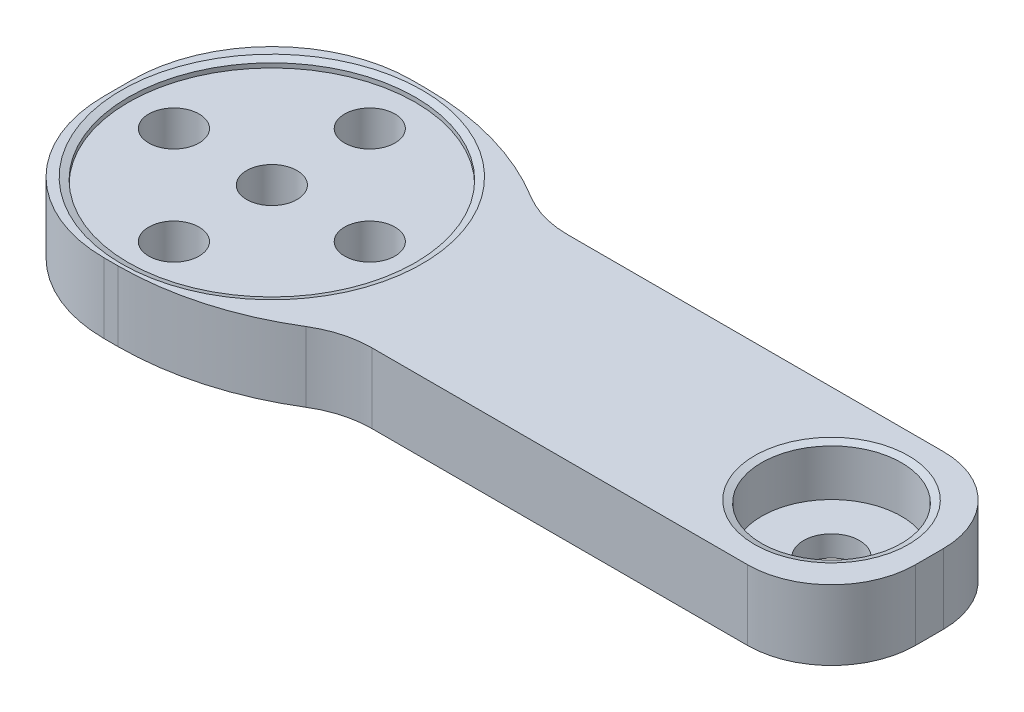
ISO-10303-21;
HEADER;
FILE_DESCRIPTION(('STEP AP214'),'2;1');
FILE_NAME('part.step','',(''),(''),'','','');
FILE_SCHEMA(('AUTOMOTIVE_DESIGN { 1 0 10303 214 1 1 1 1 }'));
ENDSEC;
DATA;
#1=APPLICATION_CONTEXT('core data for automotive mechanical design processes');
#2=APPLICATION_PROTOCOL_DEFINITION('international standard','automotive_design',2000,#1);
#3=PRODUCT_CONTEXT('',#1,'mechanical');
#4=PRODUCT('Part','Part','',(#3));
#5=PRODUCT_RELATED_PRODUCT_CATEGORY('part','',(#4));
#6=PRODUCT_DEFINITION_FORMATION('','',#4);
#7=PRODUCT_DEFINITION_CONTEXT('part definition',#1,'design');
#8=PRODUCT_DEFINITION('design','',#6,#7);
#9=PRODUCT_DEFINITION_SHAPE('','',#8);
#10=(LENGTH_UNIT() NAMED_UNIT(*) SI_UNIT(.MILLI.,.METRE.));
#11=(NAMED_UNIT(*) PLANE_ANGLE_UNIT() SI_UNIT($,.RADIAN.));
#12=(NAMED_UNIT(*) SI_UNIT($,.STERADIAN.) SOLID_ANGLE_UNIT());
#13=UNCERTAINTY_MEASURE_WITH_UNIT(LENGTH_MEASURE(1.E-05),#10,'distance_accuracy_value','');
#14=(GEOMETRIC_REPRESENTATION_CONTEXT(3) GLOBAL_UNCERTAINTY_ASSIGNED_CONTEXT((#13)) GLOBAL_UNIT_ASSIGNED_CONTEXT((#10,
#11,#12)) REPRESENTATION_CONTEXT('',''));
#15=CARTESIAN_POINT('',(0.,0.,0.));
#16=DIRECTION('',(0.,0.,1.));
#17=DIRECTION('',(1.,0.,0.));
#18=AXIS2_PLACEMENT_3D('',#15,#16,#17);
#19=CARTESIAN_POINT('',(29.,5.,11.));
#20=DIRECTION('',(-1.,0.,0.));
#21=DIRECTION('',(0.,0.,1.));
#22=AXIS2_PLACEMENT_3D('',#19,#20,#21);
#23=PLANE('',#22);
#24=DIRECTION('',(0.,0.,-1.));
#25=VECTOR('',#24,1.);
#26=CARTESIAN_POINT('',(29.,0.,11.));
#27=LINE('',#26,#25);
#28=CARTESIAN_POINT('',(29.,0.,1.));
#29=VERTEX_POINT('',#28);
#30=CARTESIAN_POINT('',(29.,0.,-0.999999999999999));
#31=VERTEX_POINT('',#30);
#32=EDGE_CURVE('E179',#29,#31,#27,.T.);
#33=ORIENTED_EDGE('',*,*,#32,.T.);
#34=DIRECTION('',(0.,1.,0.));
#35=VECTOR('',#34,1.);
#36=CARTESIAN_POINT('',(29.,5.,-0.999999999999999));
#37=LINE('',#36,#35);
#38=CARTESIAN_POINT('',(29.,5.,-0.999999999999999));
#39=VERTEX_POINT('',#38);
#40=EDGE_CURVE('E232',#31,#39,#37,.T.);
#41=ORIENTED_EDGE('',*,*,#40,.T.);
#42=DIRECTION('',(0.,0.,-1.));
#43=VECTOR('',#42,1.);
#44=CARTESIAN_POINT('',(29.,5.,11.));
#45=LINE('',#44,#43);
#46=CARTESIAN_POINT('',(29.,5.,1.));
#47=VERTEX_POINT('',#46);
#48=EDGE_CURVE('E177',#47,#39,#45,.T.);
#49=ORIENTED_EDGE('',*,*,#48,.F.);
#50=DIRECTION('',(0.,1.,0.));
#51=VECTOR('',#50,1.);
#52=CARTESIAN_POINT('',(29.,5.,1.));
#53=LINE('',#52,#51);
#54=EDGE_CURVE('E229',#47,#29,#53,.F.);
#55=ORIENTED_EDGE('',*,*,#54,.T.);
#56=EDGE_LOOP('',(#33,#41,#49,#55));
#57=FACE_BOUND('',#56,.T.);
#58=ADVANCED_FACE('F41',(#57),#23,.F.);
#59=CARTESIAN_POINT('',(-29.,5.,-11.));
#60=DIRECTION('',(0.,0.,1.));
#61=DIRECTION('',(1.,0.,0.));
#62=AXIS2_PLACEMENT_3D('',#59,#60,#61);
#63=PLANE('',#62);
#64=DIRECTION('',(-1.,0.,0.));
#65=VECTOR('',#64,1.);
#66=CARTESIAN_POINT('',(-29.,5.,-11.));
#67=LINE('',#66,#65);
#68=CARTESIAN_POINT('',(-18.,5.,-11.));
#69=VERTEX_POINT('',#68);
#70=CARTESIAN_POINT('',(-19.,5.,-11.));
#71=VERTEX_POINT('',#70);
#72=EDGE_CURVE('E301',#69,#71,#67,.T.);
#73=ORIENTED_EDGE('',*,*,#72,.F.);
#74=DIRECTION('',(0.,1.,0.));
#75=VECTOR('',#74,1.);
#76=CARTESIAN_POINT('',(-18.,5.,-11.));
#77=LINE('',#76,#75);
#78=CARTESIAN_POINT('',(-18.,0.,-11.));
#79=VERTEX_POINT('',#78);
#80=EDGE_CURVE('E264',#69,#79,#77,.F.);
#81=ORIENTED_EDGE('',*,*,#80,.T.);
#82=DIRECTION('',(-1.,0.,0.));
#83=VECTOR('',#82,1.);
#84=CARTESIAN_POINT('',(-29.,0.,-11.));
#85=LINE('',#84,#83);
#86=CARTESIAN_POINT('',(-19.,0.,-11.));
#87=VERTEX_POINT('',#86);
#88=EDGE_CURVE('E172',#79,#87,#85,.T.);
#89=ORIENTED_EDGE('',*,*,#88,.T.);
#90=DIRECTION('',(0.,-1.,0.));
#91=VECTOR('',#90,1.);
#92=CARTESIAN_POINT('',(-19.,5.,-11.));
#93=LINE('',#92,#91);
#94=EDGE_CURVE('E149',#87,#71,#93,.F.);
#95=ORIENTED_EDGE('',*,*,#94,.T.);
#96=EDGE_LOOP('',(#73,#81,#89,#95));
#97=FACE_BOUND('',#96,.T.);
#98=ADVANCED_FACE('F397',(#97),#63,.F.);
#99=CARTESIAN_POINT('',(-29.,5.,11.));
#100=DIRECTION('',(1.,0.,0.));
#101=DIRECTION('',(0.,0.,-1.));
#102=AXIS2_PLACEMENT_3D('',#99,#100,#101);
#103=PLANE('',#102);
#104=DIRECTION('',(0.,0.,1.));
#105=VECTOR('',#104,1.);
#106=CARTESIAN_POINT('',(-29.,5.,11.));
#107=LINE('',#106,#105);
#108=CARTESIAN_POINT('',(-29.,5.,-0.999999999999999));
#109=VERTEX_POINT('',#108);
#110=CARTESIAN_POINT('',(-29.,5.,0.999999999999999));
#111=VERTEX_POINT('',#110);
#112=EDGE_CURVE('E163',#109,#111,#107,.T.);
#113=ORIENTED_EDGE('',*,*,#112,.F.);
#114=DIRECTION('',(0.,-1.,0.));
#115=VECTOR('',#114,1.);
#116=CARTESIAN_POINT('',(-29.,5.,-0.999999999999999));
#117=LINE('',#116,#115);
#118=CARTESIAN_POINT('',(-29.,0.,-0.999999999999999));
#119=VERTEX_POINT('',#118);
#120=EDGE_CURVE('E147',#109,#119,#117,.T.);
#121=ORIENTED_EDGE('',*,*,#120,.T.);
#122=DIRECTION('',(0.,0.,1.));
#123=VECTOR('',#122,1.);
#124=CARTESIAN_POINT('',(-29.,0.,11.));
#125=LINE('',#124,#123);
#126=CARTESIAN_POINT('',(-29.,0.,0.999999999999999));
#127=VERTEX_POINT('',#126);
#128=EDGE_CURVE('E160',#119,#127,#125,.T.);
#129=ORIENTED_EDGE('',*,*,#128,.T.);
#130=DIRECTION('',(0.,-1.,0.));
#131=VECTOR('',#130,1.);
#132=CARTESIAN_POINT('',(-29.,5.,0.999999999999999));
#133=LINE('',#132,#131);
#134=EDGE_CURVE('E165',#127,#111,#133,.F.);
#135=ORIENTED_EDGE('',*,*,#134,.T.);
#136=EDGE_LOOP('',(#113,#121,#129,#135));
#137=FACE_BOUND('',#136,.T.);
#138=ADVANCED_FACE('F159',(#137),#103,.F.);
#139=CARTESIAN_POINT('',(-29.,5.,11.));
#140=DIRECTION('',(0.,0.,-1.));
#141=DIRECTION('',(-1.,0.,0.));
#142=AXIS2_PLACEMENT_3D('',#139,#140,#141);
#143=PLANE('',#142);
#144=DIRECTION('',(1.,0.,0.));
#145=VECTOR('',#144,1.);
#146=CARTESIAN_POINT('',(-29.,0.,11.));
#147=LINE('',#146,#145);
#148=CARTESIAN_POINT('',(-19.,0.,11.));
#149=VERTEX_POINT('',#148);
#150=CARTESIAN_POINT('',(-18.,0.,11.));
#151=VERTEX_POINT('',#150);
#152=EDGE_CURVE('E171',#149,#151,#147,.T.);
#153=ORIENTED_EDGE('',*,*,#152,.T.);
#154=DIRECTION('',(0.,-1.,0.));
#155=VECTOR('',#154,1.);
#156=CARTESIAN_POINT('',(-18.,5.,11.));
#157=LINE('',#156,#155);
#158=CARTESIAN_POINT('',(-18.,5.,11.));
#159=VERTEX_POINT('',#158);
#160=EDGE_CURVE('E273',#151,#159,#157,.F.);
#161=ORIENTED_EDGE('',*,*,#160,.T.);
#162=DIRECTION('',(1.,0.,0.));
#163=VECTOR('',#162,1.);
#164=CARTESIAN_POINT('',(-29.,5.,11.));
#165=LINE('',#164,#163);
#166=CARTESIAN_POINT('',(-19.,5.,11.));
#167=VERTEX_POINT('',#166);
#168=EDGE_CURVE('E187',#167,#159,#165,.T.);
#169=ORIENTED_EDGE('',*,*,#168,.F.);
#170=DIRECTION('',(0.,-1.,0.));
#171=VECTOR('',#170,1.);
#172=CARTESIAN_POINT('',(-19.,5.,11.));
#173=LINE('',#172,#171);
#174=EDGE_CURVE('E225',#167,#149,#173,.T.);
#175=ORIENTED_EDGE('',*,*,#174,.T.);
#176=EDGE_LOOP('',(#153,#161,#169,#175));
#177=FACE_BOUND('',#176,.T.);
#178=ADVANCED_FACE('F454',(#177),#143,.F.);
#179=CARTESIAN_POINT('',(0.,5.,0.));
#180=DIRECTION('',(0.,-1.,0.));
#181=DIRECTION('',(0.,0.,-1.));
#182=AXIS2_PLACEMENT_3D('',#179,#180,#181);
#183=PLANE('',#182);
#184=CARTESIAN_POINT('',(-18.,5.,0.));
#185=DIRECTION('',(0.,-1.,0.));
#186=DIRECTION('',(0.,0.,-1.));
#187=AXIS2_PLACEMENT_3D('',#184,#185,#186);
#188=CIRCLE('',#187,10.75);
#189=CARTESIAN_POINT('',(-18.,5.,-10.75));
#190=VERTEX_POINT('',#189);
#191=EDGE_CURVE('E199',#190,#190,#188,.T.);
#192=ORIENTED_EDGE('',*,*,#191,.T.);
#193=EDGE_LOOP('',(#192));
#194=FACE_BOUND('',#193,.T.);
#195=CARTESIAN_POINT('',(22.,5.,0.));
#196=DIRECTION('',(0.,-1.,0.));
#197=DIRECTION('',(0.,0.,-1.));
#198=AXIS2_PLACEMENT_3D('',#195,#196,#197);
#199=CIRCLE('',#198,5.50000000000002);
#200=CARTESIAN_POINT('',(22.,5.,5.50000000000002));
#201=VERTEX_POINT('',#200);
#202=EDGE_CURVE('E195',#201,#201,#199,.T.);
#203=ORIENTED_EDGE('',*,*,#202,.T.);
#204=EDGE_LOOP('',(#203));
#205=FACE_BOUND('',#204,.T.);
#206=DIRECTION('',(1.,0.,0.));
#207=VECTOR('',#206,1.);
#208=CARTESIAN_POINT('',(29.,5.,-7.));
#209=LINE('',#208,#207);
#210=CARTESIAN_POINT('',(-3.85786437626905,5.,-6.99999999999999));
#211=VERTEX_POINT('',#210);
#212=CARTESIAN_POINT('',(23.,5.,-7.));
#213=VERTEX_POINT('',#212);
#214=EDGE_CURVE('E362',#211,#213,#209,.T.);
#215=ORIENTED_EDGE('',*,*,#214,.F.);
#216=CARTESIAN_POINT('',(-3.85786437626905,5.,-14.));
#217=DIRECTION('',(0.,-1.,0.));
#218=DIRECTION('',(0.,0.,-1.));
#219=AXIS2_PLACEMENT_3D('',#216,#217,#218);
#220=CIRCLE('',#219,7.);
#221=CARTESIAN_POINT('',(-7.52434398242152,5.,-8.03703703703703));
#222=VERTEX_POINT('',#221);
#223=EDGE_CURVE('E50',#211,#222,#220,.T.);
#224=ORIENTED_EDGE('',*,*,#223,.T.);
#225=CARTESIAN_POINT('',(-18.,5.,9.));
#226=DIRECTION('',(0.,-1.,0.));
#227=DIRECTION('',(0.,0.,-1.));
#228=AXIS2_PLACEMENT_3D('',#225,#226,#227);
#229=CIRCLE('',#228,20.);
#230=EDGE_CURVE('E261',#222,#69,#229,.F.);
#231=ORIENTED_EDGE('',*,*,#230,.T.);
#232=ORIENTED_EDGE('',*,*,#72,.T.);
#233=CARTESIAN_POINT('',(-19.,5.,-0.999999999999999));
#234=DIRECTION('',(0.,-1.,0.));
#235=DIRECTION('',(0.,0.,-1.));
#236=AXIS2_PLACEMENT_3D('',#233,#234,#235);
#237=CIRCLE('',#236,10.);
#238=EDGE_CURVE('E222',#71,#109,#237,.F.);
#239=ORIENTED_EDGE('',*,*,#238,.T.);
#240=ORIENTED_EDGE('',*,*,#112,.T.);
#241=CARTESIAN_POINT('',(-19.,5.,0.999999999999999));
#242=DIRECTION('',(0.,-1.,0.));
#243=DIRECTION('',(0.,0.,-1.));
#244=AXIS2_PLACEMENT_3D('',#241,#242,#243);
#245=CIRCLE('',#244,10.);
#246=EDGE_CURVE('E219',#111,#167,#245,.F.);
#247=ORIENTED_EDGE('',*,*,#246,.T.);
#248=ORIENTED_EDGE('',*,*,#168,.T.);
#249=CARTESIAN_POINT('',(-18.,5.,-9.));
#250=DIRECTION('',(0.,-1.,0.));
#251=DIRECTION('',(0.,0.,-1.));
#252=AXIS2_PLACEMENT_3D('',#249,#250,#251);
#253=CIRCLE('',#252,20.);
#254=CARTESIAN_POINT('',(-7.52434398242152,5.,8.03703703703704));
#255=VERTEX_POINT('',#254);
#256=EDGE_CURVE('E257',#159,#255,#253,.F.);
#257=ORIENTED_EDGE('',*,*,#256,.T.);
#258=CARTESIAN_POINT('',(-3.85786437626905,5.,14.));
#259=DIRECTION('',(0.,-1.,0.));
#260=DIRECTION('',(0.,0.,-1.));
#261=AXIS2_PLACEMENT_3D('',#258,#259,#260);
#262=CIRCLE('',#261,7.);
#263=CARTESIAN_POINT('',(-3.85786437626906,5.,7.00000000000001));
#264=VERTEX_POINT('',#263);
#265=EDGE_CURVE('E290',#255,#264,#262,.T.);
#266=ORIENTED_EDGE('',*,*,#265,.T.);
#267=DIRECTION('',(-1.,0.,0.));
#268=VECTOR('',#267,1.);
#269=CARTESIAN_POINT('',(29.,5.,7.));
#270=LINE('',#269,#268);
#271=CARTESIAN_POINT('',(23.,5.,7.));
#272=VERTEX_POINT('',#271);
#273=EDGE_CURVE('E363',#272,#264,#270,.T.);
#274=ORIENTED_EDGE('',*,*,#273,.F.);
#275=CARTESIAN_POINT('',(23.,5.,1.));
#276=DIRECTION('',(0.,-1.,0.));
#277=DIRECTION('',(0.,0.,-1.));
#278=AXIS2_PLACEMENT_3D('',#275,#276,#277);
#279=CIRCLE('',#278,6.);
#280=EDGE_CURVE('E236',#272,#47,#279,.F.);
#281=ORIENTED_EDGE('',*,*,#280,.T.);
#282=ORIENTED_EDGE('',*,*,#48,.T.);
#283=CARTESIAN_POINT('',(23.,5.,-0.999999999999999));
#284=DIRECTION('',(0.,-1.,0.));
#285=DIRECTION('',(0.,0.,-1.));
#286=AXIS2_PLACEMENT_3D('',#283,#284,#285);
#287=CIRCLE('',#286,6.);
#288=EDGE_CURVE('E239',#39,#213,#287,.F.);
#289=ORIENTED_EDGE('',*,*,#288,.T.);
#290=EDGE_LOOP('',(#215,#224,#231,#232,#239,#240,#247,#248,#257,#266,#274,#281,#282,#289));
#291=FACE_BOUND('',#290,.T.);
#292=ADVANCED_FACE('F456',(#194,#205,#291),#183,.F.);
#293=CARTESIAN_POINT('',(0.,0.,0.));
#294=DIRECTION('',(0.,-1.,0.));
#295=DIRECTION('',(0.,0.,-1.));
#296=AXIS2_PLACEMENT_3D('',#293,#294,#295);
#297=PLANE('',#296);
#298=CARTESIAN_POINT('',(22.,0.,0.));
#299=DIRECTION('',(0.,-1.,0.));
#300=DIRECTION('',(0.,0.,-1.));
#301=AXIS2_PLACEMENT_3D('',#298,#299,#300);
#302=CIRCLE('',#301,2.);
#303=CARTESIAN_POINT('',(22.,0.,-2.));
#304=VERTEX_POINT('',#303);
#305=EDGE_CURVE('E207',#304,#304,#302,.T.);
#306=ORIENTED_EDGE('',*,*,#305,.F.);
#307=EDGE_LOOP('',(#306));
#308=FACE_BOUND('',#307,.T.);
#309=ORIENTED_EDGE('',*,*,#88,.F.);
#310=CARTESIAN_POINT('',(-18.,0.,9.));
#311=DIRECTION('',(0.,-1.,0.));
#312=DIRECTION('',(0.,0.,-1.));
#313=AXIS2_PLACEMENT_3D('',#310,#311,#312);
#314=CIRCLE('',#313,20.);
#315=CARTESIAN_POINT('',(-7.52434398242152,0.,-8.03703703703703));
#316=VERTEX_POINT('',#315);
#317=EDGE_CURVE('E270',#79,#316,#314,.T.);
#318=ORIENTED_EDGE('',*,*,#317,.T.);
#319=CARTESIAN_POINT('',(-3.85786437626905,0.,-14.));
#320=DIRECTION('',(0.,-1.,0.));
#321=DIRECTION('',(0.,0.,-1.));
#322=AXIS2_PLACEMENT_3D('',#319,#320,#321);
#323=CIRCLE('',#322,7.);
#324=CARTESIAN_POINT('',(-3.85786437626905,0.,-6.99999999999999));
#325=VERTEX_POINT('',#324);
#326=EDGE_CURVE('E11',#316,#325,#323,.F.);
#327=ORIENTED_EDGE('',*,*,#326,.T.);
#328=DIRECTION('',(-1.,0.,0.));
#329=VECTOR('',#328,1.);
#330=CARTESIAN_POINT('',(0.,0.,-7.));
#331=LINE('',#330,#329);
#332=CARTESIAN_POINT('',(23.,0.,-7.));
#333=VERTEX_POINT('',#332);
#334=EDGE_CURVE('E186',#333,#325,#331,.T.);
#335=ORIENTED_EDGE('',*,*,#334,.F.);
#336=CARTESIAN_POINT('',(23.,0.,-0.999999999999999));
#337=DIRECTION('',(0.,-1.,0.));
#338=DIRECTION('',(0.,0.,-1.));
#339=AXIS2_PLACEMENT_3D('',#336,#337,#338);
#340=CIRCLE('',#339,6.);
#341=EDGE_CURVE('E250',#333,#31,#340,.T.);
#342=ORIENTED_EDGE('',*,*,#341,.T.);
#343=ORIENTED_EDGE('',*,*,#32,.F.);
#344=CARTESIAN_POINT('',(23.,0.,1.));
#345=DIRECTION('',(0.,-1.,0.));
#346=DIRECTION('',(0.,0.,-1.));
#347=AXIS2_PLACEMENT_3D('',#344,#345,#346);
#348=CIRCLE('',#347,6.);
#349=CARTESIAN_POINT('',(23.,0.,7.));
#350=VERTEX_POINT('',#349);
#351=EDGE_CURVE('E246',#29,#350,#348,.T.);
#352=ORIENTED_EDGE('',*,*,#351,.T.);
#353=DIRECTION('',(1.,0.,0.));
#354=VECTOR('',#353,1.);
#355=CARTESIAN_POINT('',(0.,0.,7.00000000000001));
#356=LINE('',#355,#354);
#357=CARTESIAN_POINT('',(-3.85786437626906,0.,7.00000000000001));
#358=VERTEX_POINT('',#357);
#359=EDGE_CURVE('E183',#358,#350,#356,.T.);
#360=ORIENTED_EDGE('',*,*,#359,.F.);
#361=CARTESIAN_POINT('',(-3.85786437626905,0.,14.));
#362=DIRECTION('',(0.,-1.,0.));
#363=DIRECTION('',(0.,0.,-1.));
#364=AXIS2_PLACEMENT_3D('',#361,#362,#363);
#365=CIRCLE('',#364,7.);
#366=CARTESIAN_POINT('',(-7.52434398242152,0.,8.03703703703704));
#367=VERTEX_POINT('',#366);
#368=EDGE_CURVE('E293',#358,#367,#365,.F.);
#369=ORIENTED_EDGE('',*,*,#368,.T.);
#370=CARTESIAN_POINT('',(-18.,0.,-9.));
#371=DIRECTION('',(0.,-1.,0.));
#372=DIRECTION('',(0.,0.,-1.));
#373=AXIS2_PLACEMENT_3D('',#370,#371,#372);
#374=CIRCLE('',#373,20.);
#375=EDGE_CURVE('E267',#367,#151,#374,.T.);
#376=ORIENTED_EDGE('',*,*,#375,.T.);
#377=ORIENTED_EDGE('',*,*,#152,.F.);
#378=CARTESIAN_POINT('',(-19.,0.,0.999999999999999));
#379=DIRECTION('',(0.,-1.,0.));
#380=DIRECTION('',(0.,0.,-1.));
#381=AXIS2_PLACEMENT_3D('',#378,#379,#380);
#382=CIRCLE('',#381,10.);
#383=EDGE_CURVE('E154',#149,#127,#382,.T.);
#384=ORIENTED_EDGE('',*,*,#383,.T.);
#385=ORIENTED_EDGE('',*,*,#128,.F.);
#386=CARTESIAN_POINT('',(-19.,0.,-0.999999999999999));
#387=DIRECTION('',(0.,-1.,0.));
#388=DIRECTION('',(0.,0.,-1.));
#389=AXIS2_PLACEMENT_3D('',#386,#387,#388);
#390=CIRCLE('',#389,10.);
#391=EDGE_CURVE('E143',#119,#87,#390,.T.);
#392=ORIENTED_EDGE('',*,*,#391,.T.);
#393=EDGE_LOOP('',(#309,#318,#327,#335,#342,#343,#352,#360,#369,#376,#377,#384,#385,#392));
#394=FACE_BOUND('',#393,.T.);
#395=CARTESIAN_POINT('',(-18.,0.,-7.));
#396=DIRECTION('',(0.,-1.,0.));
#397=DIRECTION('',(0.,0.,-1.));
#398=AXIS2_PLACEMENT_3D('',#395,#396,#397);
#399=CIRCLE('',#398,1.8);
#400=CARTESIAN_POINT('',(-18.,0.,-8.8));
#401=VERTEX_POINT('',#400);
#402=EDGE_CURVE('E354',#401,#401,#399,.T.);
#403=ORIENTED_EDGE('',*,*,#402,.F.);
#404=EDGE_LOOP('',(#403));
#405=FACE_BOUND('',#404,.T.);
#406=CARTESIAN_POINT('',(-18.,0.,0.));
#407=DIRECTION('',(0.,-1.,0.));
#408=DIRECTION('',(0.,0.,-1.));
#409=AXIS2_PLACEMENT_3D('',#406,#407,#408);
#410=CIRCLE('',#409,1.8);
#411=CARTESIAN_POINT('',(-18.,0.,-1.8));
#412=VERTEX_POINT('',#411);
#413=EDGE_CURVE('E318',#412,#412,#410,.T.);
#414=ORIENTED_EDGE('',*,*,#413,.F.);
#415=EDGE_LOOP('',(#414));
#416=FACE_BOUND('',#415,.T.);
#417=CARTESIAN_POINT('',(-25.,0.,0.));
#418=DIRECTION('',(0.,-1.,0.));
#419=DIRECTION('',(0.,0.,-1.));
#420=AXIS2_PLACEMENT_3D('',#417,#418,#419);
#421=CIRCLE('',#420,1.8);
#422=CARTESIAN_POINT('',(-25.,0.,-1.8));
#423=VERTEX_POINT('',#422);
#424=EDGE_CURVE('E338',#423,#423,#421,.T.);
#425=ORIENTED_EDGE('',*,*,#424,.F.);
#426=EDGE_LOOP('',(#425));
#427=FACE_BOUND('',#426,.T.);
#428=CARTESIAN_POINT('',(-18.,0.,7.));
#429=DIRECTION('',(0.,-1.,0.));
#430=DIRECTION('',(0.,0.,-1.));
#431=AXIS2_PLACEMENT_3D('',#428,#429,#430);
#432=CIRCLE('',#431,1.8);
#433=CARTESIAN_POINT('',(-18.,0.,5.2));
#434=VERTEX_POINT('',#433);
#435=EDGE_CURVE('E346',#434,#434,#432,.T.);
#436=ORIENTED_EDGE('',*,*,#435,.F.);
#437=EDGE_LOOP('',(#436));
#438=FACE_BOUND('',#437,.T.);
#439=CARTESIAN_POINT('',(-11.,0.,0.));
#440=DIRECTION('',(0.,-1.,0.));
#441=DIRECTION('',(0.,0.,-1.));
#442=AXIS2_PLACEMENT_3D('',#439,#440,#441);
#443=CIRCLE('',#442,1.8);
#444=CARTESIAN_POINT('',(-11.,0.,-1.8));
#445=VERTEX_POINT('',#444);
#446=EDGE_CURVE('E328',#445,#445,#443,.T.);
#447=ORIENTED_EDGE('',*,*,#446,.F.);
#448=EDGE_LOOP('',(#447));
#449=FACE_BOUND('',#448,.T.);
#450=ADVANCED_FACE('F167',(#308,#394,#405,#416,#427,#438,#449),#297,.T.);
#451=CARTESIAN_POINT('',(-18.,4.5,0.));
#452=DIRECTION('',(0.,1.,0.));
#453=DIRECTION('',(0.,0.,1.));
#454=AXIS2_PLACEMENT_3D('',#451,#452,#453);
#455=CYLINDRICAL_SURFACE('',#454,10.25);
#456=CARTESIAN_POINT('',(-18.,4.81801488286689,0.));
#457=DIRECTION('',(0.,-1.,0.));
#458=DIRECTION('',(0.,0.,-1.));
#459=AXIS2_PLACEMENT_3D('',#456,#457,#458);
#460=CIRCLE('',#459,10.25);
#461=CARTESIAN_POINT('',(-18.,4.81801488286689,-10.25));
#462=VERTEX_POINT('',#461);
#463=EDGE_CURVE('E191',#462,#462,#460,.F.);
#464=ORIENTED_EDGE('',*,*,#463,.T.);
#465=EDGE_LOOP('',(#464));
#466=FACE_BOUND('',#465,.T.);
#467=CARTESIAN_POINT('',(-18.,4.5,0.));
#468=DIRECTION('',(0.,1.,0.));
#469=DIRECTION('',(0.,0.,1.));
#470=AXIS2_PLACEMENT_3D('',#467,#468,#469);
#471=CIRCLE('',#470,10.25);
#472=CARTESIAN_POINT('',(-18.,4.5,10.25));
#473=VERTEX_POINT('',#472);
#474=EDGE_CURVE('E309',#473,#473,#471,.T.);
#475=ORIENTED_EDGE('',*,*,#474,.F.);
#476=EDGE_LOOP('',(#475));
#477=FACE_BOUND('',#476,.T.);
#478=ADVANCED_FACE('F497',(#466,#477),#455,.F.);
#479=CARTESIAN_POINT('',(0.,4.5,0.));
#480=DIRECTION('',(0.,1.,0.));
#481=DIRECTION('',(0.,0.,1.));
#482=AXIS2_PLACEMENT_3D('',#479,#480,#481);
#483=PLANE('',#482);
#484=CARTESIAN_POINT('',(-18.,4.5,0.));
#485=DIRECTION('',(0.,1.,0.));
#486=DIRECTION('',(0.,0.,1.));
#487=AXIS2_PLACEMENT_3D('',#484,#485,#486);
#488=CIRCLE('',#487,1.8);
#489=CARTESIAN_POINT('',(-18.,4.5,1.8));
#490=VERTEX_POINT('',#489);
#491=EDGE_CURVE('E323',#490,#490,#488,.T.);
#492=ORIENTED_EDGE('',*,*,#491,.F.);
#493=EDGE_LOOP('',(#492));
#494=FACE_BOUND('',#493,.T.);
#495=CARTESIAN_POINT('',(-11.,4.5,0.));
#496=DIRECTION('',(0.,1.,0.));
#497=DIRECTION('',(0.,0.,1.));
#498=AXIS2_PLACEMENT_3D('',#495,#496,#497);
#499=CIRCLE('',#498,1.8);
#500=CARTESIAN_POINT('',(-11.,4.5,1.8));
#501=VERTEX_POINT('',#500);
#502=EDGE_CURVE('E334',#501,#501,#499,.T.);
#503=ORIENTED_EDGE('',*,*,#502,.F.);
#504=EDGE_LOOP('',(#503));
#505=FACE_BOUND('',#504,.T.);
#506=CARTESIAN_POINT('',(-25.,4.5,0.));
#507=DIRECTION('',(0.,1.,0.));
#508=DIRECTION('',(0.,0.,1.));
#509=AXIS2_PLACEMENT_3D('',#506,#507,#508);
#510=CIRCLE('',#509,1.8);
#511=CARTESIAN_POINT('',(-25.,4.5,1.8));
#512=VERTEX_POINT('',#511);
#513=EDGE_CURVE('E342',#512,#512,#510,.T.);
#514=ORIENTED_EDGE('',*,*,#513,.F.);
#515=EDGE_LOOP('',(#514));
#516=FACE_BOUND('',#515,.T.);
#517=CARTESIAN_POINT('',(-18.,4.5,7.));
#518=DIRECTION('',(0.,1.,0.));
#519=DIRECTION('',(0.,0.,1.));
#520=AXIS2_PLACEMENT_3D('',#517,#518,#519);
#521=CIRCLE('',#520,1.8);
#522=CARTESIAN_POINT('',(-18.,4.5,8.8));
#523=VERTEX_POINT('',#522);
#524=EDGE_CURVE('E350',#523,#523,#521,.T.);
#525=ORIENTED_EDGE('',*,*,#524,.F.);
#526=EDGE_LOOP('',(#525));
#527=FACE_BOUND('',#526,.T.);
#528=CARTESIAN_POINT('',(-18.,4.5,-7.));
#529=DIRECTION('',(0.,1.,0.));
#530=DIRECTION('',(0.,0.,1.));
#531=AXIS2_PLACEMENT_3D('',#528,#529,#530);
#532=CIRCLE('',#531,1.8);
#533=CARTESIAN_POINT('',(-18.,4.5,-5.2));
#534=VERTEX_POINT('',#533);
#535=EDGE_CURVE('E358',#534,#534,#532,.T.);
#536=ORIENTED_EDGE('',*,*,#535,.F.);
#537=EDGE_LOOP('',(#536));
#538=FACE_BOUND('',#537,.T.);
#539=ORIENTED_EDGE('',*,*,#474,.T.);
#540=EDGE_LOOP('',(#539));
#541=FACE_BOUND('',#540,.T.);
#542=ADVANCED_FACE('F490',(#494,#505,#516,#527,#538,#541),#483,.T.);
#543=CARTESIAN_POINT('',(-11.,-5.,0.));
#544=DIRECTION('',(0.,1.,0.));
#545=DIRECTION('',(0.,0.,1.));
#546=AXIS2_PLACEMENT_3D('',#543,#544,#545);
#547=CYLINDRICAL_SURFACE('',#546,1.8);
#548=ORIENTED_EDGE('',*,*,#446,.T.);
#549=EDGE_LOOP('',(#548));
#550=FACE_BOUND('',#549,.T.);
#551=ORIENTED_EDGE('',*,*,#502,.T.);
#552=EDGE_LOOP('',(#551));
#553=FACE_BOUND('',#552,.T.);
#554=ADVANCED_FACE('F487',(#550,#553),#547,.F.);
#555=CARTESIAN_POINT('',(-18.,-5.,7.));
#556=DIRECTION('',(0.,1.,0.));
#557=DIRECTION('',(0.,0.,1.));
#558=AXIS2_PLACEMENT_3D('',#555,#556,#557);
#559=CYLINDRICAL_SURFACE('',#558,1.8);
#560=ORIENTED_EDGE('',*,*,#435,.T.);
#561=EDGE_LOOP('',(#560));
#562=FACE_BOUND('',#561,.T.);
#563=ORIENTED_EDGE('',*,*,#524,.T.);
#564=EDGE_LOOP('',(#563));
#565=FACE_BOUND('',#564,.T.);
#566=ADVANCED_FACE('F483',(#562,#565),#559,.F.);
#567=CARTESIAN_POINT('',(-25.,-5.,0.));
#568=DIRECTION('',(0.,1.,0.));
#569=DIRECTION('',(0.,0.,1.));
#570=AXIS2_PLACEMENT_3D('',#567,#568,#569);
#571=CYLINDRICAL_SURFACE('',#570,1.8);
#572=ORIENTED_EDGE('',*,*,#424,.T.);
#573=EDGE_LOOP('',(#572));
#574=FACE_BOUND('',#573,.T.);
#575=ORIENTED_EDGE('',*,*,#513,.T.);
#576=EDGE_LOOP('',(#575));
#577=FACE_BOUND('',#576,.T.);
#578=ADVANCED_FACE('F480',(#574,#577),#571,.F.);
#579=CARTESIAN_POINT('',(-18.,-5.,0.));
#580=DIRECTION('',(0.,1.,0.));
#581=DIRECTION('',(0.,0.,1.));
#582=AXIS2_PLACEMENT_3D('',#579,#580,#581);
#583=CYLINDRICAL_SURFACE('',#582,1.8);
#584=ORIENTED_EDGE('',*,*,#413,.T.);
#585=EDGE_LOOP('',(#584));
#586=FACE_BOUND('',#585,.T.);
#587=ORIENTED_EDGE('',*,*,#491,.T.);
#588=EDGE_LOOP('',(#587));
#589=FACE_BOUND('',#588,.T.);
#590=ADVANCED_FACE('F476',(#586,#589),#583,.F.);
#591=CARTESIAN_POINT('',(-18.,-5.,-7.));
#592=DIRECTION('',(0.,1.,0.));
#593=DIRECTION('',(0.,0.,1.));
#594=AXIS2_PLACEMENT_3D('',#591,#592,#593);
#595=CYLINDRICAL_SURFACE('',#594,1.8);
#596=ORIENTED_EDGE('',*,*,#402,.T.);
#597=EDGE_LOOP('',(#596));
#598=FACE_BOUND('',#597,.T.);
#599=ORIENTED_EDGE('',*,*,#535,.T.);
#600=EDGE_LOOP('',(#599));
#601=FACE_BOUND('',#600,.T.);
#602=ADVANCED_FACE('F471',(#598,#601),#595,.F.);
#603=CARTESIAN_POINT('',(29.,-5.,7.));
#604=DIRECTION('',(0.,0.,-1.));
#605=DIRECTION('',(-1.,0.,0.));
#606=AXIS2_PLACEMENT_3D('',#603,#604,#605);
#607=PLANE('',#606);
#608=ORIENTED_EDGE('',*,*,#273,.T.);
#609=DIRECTION('',(0.,-1.,0.));
#610=VECTOR('',#609,1.);
#611=CARTESIAN_POINT('',(-3.85786437626906,-5.,7.00000000000001));
#612=LINE('',#611,#610);
#613=EDGE_CURVE('E281',#264,#358,#612,.T.);
#614=ORIENTED_EDGE('',*,*,#613,.T.);
#615=ORIENTED_EDGE('',*,*,#359,.T.);
#616=DIRECTION('',(0.,1.,0.));
#617=VECTOR('',#616,1.);
#618=CARTESIAN_POINT('',(23.,-5.,7.));
#619=LINE('',#618,#617);
#620=EDGE_CURVE('E253',#350,#272,#619,.T.);
#621=ORIENTED_EDGE('',*,*,#620,.T.);
#622=EDGE_LOOP('',(#608,#614,#615,#621));
#623=FACE_BOUND('',#622,.T.);
#624=ADVANCED_FACE('F393',(#623),#607,.F.);
#625=CARTESIAN_POINT('',(29.,-5.,-7.));
#626=DIRECTION('',(0.,0.,1.));
#627=DIRECTION('',(1.,0.,0.));
#628=AXIS2_PLACEMENT_3D('',#625,#626,#627);
#629=PLANE('',#628);
#630=ORIENTED_EDGE('',*,*,#334,.T.);
#631=DIRECTION('',(0.,1.,0.));
#632=VECTOR('',#631,1.);
#633=CARTESIAN_POINT('',(-3.85786437626905,-5.,-6.99999999999999));
#634=LINE('',#633,#632);
#635=EDGE_CURVE('E284',#325,#211,#634,.T.);
#636=ORIENTED_EDGE('',*,*,#635,.T.);
#637=ORIENTED_EDGE('',*,*,#214,.T.);
#638=DIRECTION('',(0.,1.,0.));
#639=VECTOR('',#638,1.);
#640=CARTESIAN_POINT('',(23.,-5.,-7.));
#641=LINE('',#640,#639);
#642=EDGE_CURVE('E243',#213,#333,#641,.F.);
#643=ORIENTED_EDGE('',*,*,#642,.T.);
#644=EDGE_LOOP('',(#630,#636,#637,#643));
#645=FACE_BOUND('',#644,.T.);
#646=ADVANCED_FACE('F387',(#645),#629,.F.);
#647=CARTESIAN_POINT('',(22.,1.5,0.));
#648=DIRECTION('',(0.,1.,0.));
#649=DIRECTION('',(0.,0.,1.));
#650=AXIS2_PLACEMENT_3D('',#647,#648,#649);
#651=CYLINDRICAL_SURFACE('',#650,5.);
#652=CARTESIAN_POINT('',(22.,4.81801488286689,0.));
#653=DIRECTION('',(0.,-1.,0.));
#654=DIRECTION('',(0.,0.,-1.));
#655=AXIS2_PLACEMENT_3D('',#652,#653,#654);
#656=CIRCLE('',#655,5.);
#657=CARTESIAN_POINT('',(22.,4.81801488286689,5.));
#658=VERTEX_POINT('',#657);
#659=EDGE_CURVE('E203',#658,#658,#656,.F.);
#660=ORIENTED_EDGE('',*,*,#659,.T.);
#661=EDGE_LOOP('',(#660));
#662=FACE_BOUND('',#661,.T.);
#663=CARTESIAN_POINT('',(22.,1.5,0.));
#664=DIRECTION('',(0.,1.,0.));
#665=DIRECTION('',(0.,0.,1.));
#666=AXIS2_PLACEMENT_3D('',#663,#664,#665);
#667=CIRCLE('',#666,5.);
#668=CARTESIAN_POINT('',(22.,1.5,5.));
#669=VERTEX_POINT('',#668);
#670=EDGE_CURVE('E211',#669,#669,#667,.T.);
#671=ORIENTED_EDGE('',*,*,#670,.F.);
#672=EDGE_LOOP('',(#671));
#673=FACE_BOUND('',#672,.T.);
#674=ADVANCED_FACE('F382',(#662,#673),#651,.F.);
#675=CARTESIAN_POINT('',(22.,1.5,0.));
#676=DIRECTION('',(0.,1.,0.));
#677=DIRECTION('',(0.,0.,1.));
#678=AXIS2_PLACEMENT_3D('',#675,#676,#677);
#679=PLANE('',#678);
#680=CARTESIAN_POINT('',(22.,1.5,0.));
#681=DIRECTION('',(0.,1.,0.));
#682=DIRECTION('',(0.,0.,1.));
#683=AXIS2_PLACEMENT_3D('',#680,#681,#682);
#684=CIRCLE('',#683,2.);
#685=CARTESIAN_POINT('',(22.,1.5,2.));
#686=VERTEX_POINT('',#685);
#687=EDGE_CURVE('E212',#686,#686,#684,.T.);
#688=ORIENTED_EDGE('',*,*,#687,.F.);
#689=EDGE_LOOP('',(#688));
#690=FACE_BOUND('',#689,.T.);
#691=ORIENTED_EDGE('',*,*,#670,.T.);
#692=EDGE_LOOP('',(#691));
#693=FACE_BOUND('',#692,.T.);
#694=ADVANCED_FACE('F378',(#690,#693),#679,.T.);
#695=CARTESIAN_POINT('',(-18.,4.81801488286689,0.));
#696=DIRECTION('',(0.,1.,0.));
#697=DIRECTION('',(0.,0.,1.));
#698=AXIS2_PLACEMENT_3D('',#695,#696,#697);
#699=CONICAL_SURFACE('',#698,10.25,1.22173047639603);
#700=ORIENTED_EDGE('',*,*,#191,.F.);
#701=EDGE_LOOP('',(#700));
#702=FACE_BOUND('',#701,.T.);
#703=ORIENTED_EDGE('',*,*,#463,.F.);
#704=EDGE_LOOP('',(#703));
#705=FACE_BOUND('',#704,.T.);
#706=ADVANCED_FACE('F381',(#702,#705),#699,.F.);
#707=CARTESIAN_POINT('',(22.,4.81801488286689,0.));
#708=DIRECTION('',(0.,1.,0.));
#709=DIRECTION('',(0.,0.,1.));
#710=AXIS2_PLACEMENT_3D('',#707,#708,#709);
#711=CONICAL_SURFACE('',#710,5.,1.22173047639603);
#712=CARTESIAN_POINT('',(22.,5.,5.50000000000002));
#713=CARTESIAN_POINT('',(22.,4.99810432169653,5.49479166666669));
#714=CARTESIAN_POINT('',(22.,4.99620864339306,5.48958333333335));
#715=CARTESIAN_POINT('',(22.,4.99241728678612,5.47916666666669));
#716=CARTESIAN_POINT('',(22.,4.99052160848265,5.47395833333335));
#717=CARTESIAN_POINT('',(22.,4.98673025187571,5.46354166666668));
#718=CARTESIAN_POINT('',(22.,4.98483457357224,5.45833333333335));
#719=CARTESIAN_POINT('',(22.,4.9810432169653,5.44791666666668));
#720=CARTESIAN_POINT('',(22.,4.97914753866183,5.44270833333335));
#721=CARTESIAN_POINT('',(22.,4.97535618205489,5.43229166666668));
#722=CARTESIAN_POINT('',(22.,4.97346050375142,5.42708333333335));
#723=CARTESIAN_POINT('',(22.,4.96966914714448,5.41666666666668));
#724=CARTESIAN_POINT('',(22.,4.96777346884101,5.41145833333335));
#725=CARTESIAN_POINT('',(22.,4.96398211223407,5.40104166666668));
#726=CARTESIAN_POINT('',(22.,4.9620864339306,5.39583333333335));
#727=CARTESIAN_POINT('',(22.,4.95829507732366,5.38541666666668));
#728=CARTESIAN_POINT('',(22.,4.95639939902019,5.38020833333335));
#729=CARTESIAN_POINT('',(22.,4.95260804241325,5.36979166666668));
#730=CARTESIAN_POINT('',(22.,4.95071236410978,5.36458333333335));
#731=CARTESIAN_POINT('',(22.,4.94692100750284,5.35416666666668));
#732=CARTESIAN_POINT('',(22.,4.94502532919937,5.34895833333335));
#733=CARTESIAN_POINT('',(22.,4.94123397259244,5.33854166666668));
#734=CARTESIAN_POINT('',(22.,4.93933829428896,5.33333333333335));
#735=CARTESIAN_POINT('',(22.,4.93554693768202,5.32291666666668));
#736=CARTESIAN_POINT('',(22.,4.93365125937856,5.31770833333335));
#737=CARTESIAN_POINT('',(22.,4.92985990277162,5.30729166666668));
#738=CARTESIAN_POINT('',(22.,4.92796422446815,5.30208333333335));
#739=CARTESIAN_POINT('',(22.,4.92417286786121,5.29166666666668));
#740=CARTESIAN_POINT('',(22.,4.92227718955774,5.28645833333335));
#741=CARTESIAN_POINT('',(22.,4.9184858329508,5.27604166666668));
#742=CARTESIAN_POINT('',(22.,4.91659015464733,5.27083333333335));
#743=CARTESIAN_POINT('',(22.,4.91279879804039,5.26041666666668));
#744=CARTESIAN_POINT('',(22.,4.91090311973692,5.25520833333334));
#745=CARTESIAN_POINT('',(22.,4.90711176312998,5.24479166666668));
#746=CARTESIAN_POINT('',(22.,4.90521608482651,5.23958333333334));
#747=CARTESIAN_POINT('',(22.,4.90142472821957,5.22916666666668));
#748=CARTESIAN_POINT('',(22.,4.8995290499161,5.22395833333334));
#749=CARTESIAN_POINT('',(22.,4.89573769330916,5.21354166666668));
#750=CARTESIAN_POINT('',(22.,4.89384201500569,5.20833333333334));
#751=CARTESIAN_POINT('',(22.,4.89005065839875,5.19791666666667));
#752=CARTESIAN_POINT('',(22.,4.88815498009528,5.19270833333334));
#753=CARTESIAN_POINT('',(22.,4.88436362348834,5.18229166666667));
#754=CARTESIAN_POINT('',(22.,4.88246794518487,5.17708333333334));
#755=CARTESIAN_POINT('',(22.,4.87867658857793,5.16666666666667));
#756=CARTESIAN_POINT('',(22.,4.87678091027446,5.16145833333334));
#757=CARTESIAN_POINT('',(22.,4.87298955366752,5.15104166666667));
#758=CARTESIAN_POINT('',(22.,4.87109387536405,5.14583333333334));
#759=CARTESIAN_POINT('',(22.,4.86730251875711,5.13541666666667));
#760=CARTESIAN_POINT('',(22.,4.86540684045364,5.13020833333334));
#761=CARTESIAN_POINT('',(22.,4.8616154838467,5.11979166666667));
#762=CARTESIAN_POINT('',(22.,4.85971980554323,5.11458333333334));
#763=CARTESIAN_POINT('',(22.,4.85592844893629,5.10416666666667));
#764=CARTESIAN_POINT('',(22.,4.85403277063282,5.09895833333334));
#765=CARTESIAN_POINT('',(22.,4.85024141402588,5.08854166666667));
#766=CARTESIAN_POINT('',(22.,4.84834573572241,5.08333333333334));
#767=CARTESIAN_POINT('',(22.,4.84455437911547,5.07291666666667));
#768=CARTESIAN_POINT('',(22.,4.842658700812,5.06770833333334));
#769=CARTESIAN_POINT('',(22.,4.83886734420506,5.05729166666667));
#770=CARTESIAN_POINT('',(22.,4.83697166590159,5.05208333333334));
#771=CARTESIAN_POINT('',(22.,4.83318030929465,5.04166666666667));
#772=CARTESIAN_POINT('',(22.,4.83128463099118,5.03645833333334));
#773=CARTESIAN_POINT('',(22.,4.82749327438424,5.02604166666667));
#774=CARTESIAN_POINT('',(22.,4.82559759608077,5.02083333333334));
#775=CARTESIAN_POINT('',(22.,4.82180623947383,5.01041666666667));
#776=CARTESIAN_POINT('',(22.,4.81991056117036,5.00520833333333));
#777=CARTESIAN_POINT('',(22.,4.81801488286689,5.));
#778=B_SPLINE_CURVE_WITH_KNOTS('',3,(#712,#713,#714,#715,#716,#717,#718,#719,#720,#721,#722,
#723,#724,#725,#726,#727,#728,#729,#730,#731,#732,#733,#734,#735,#736,#737,#738,#739,#740,#741,
#742,#743,#744,#745,#746,#747,#748,#749,#750,#751,#752,#753,#754,#755,#756,#757,#758,#759,#760,
#761,#762,#763,#764,#765,#766,#767,#768,#769,#770,#771,#772,#773,#774,#775,#776,#777),
.UNSPECIFIED.,.F.,.F.,(4,2,2,2,2,2,2,2,2,2,2,2,2,2,2,2,2,2,2,2,2,2,2,2,2,2,2,2,2,2,2,2,4),(0.,
0.0166277776949362,0.0332555553898732,0.0498833330848102,0.0665111107797463,0.0831388884746833,
0.0997666661696203,0.116394443864556,0.133022221559493,0.14964999925443,0.166277776949367,
0.182905554644304,0.19953333233924,0.216161110034177,0.232788887729114,0.24941666542405,
0.266044443118987,0.282672220813924,0.299299998508861,0.315927776203797,0.332555553898734,
0.349183331593671,0.365811109288608,0.382438886983545,0.399066664678481,0.415694442373418,
0.432322220068355,0.448949997763291,0.465577775458228,0.482205553153165,0.498833330848101,
0.515461108543038,0.532088886237976),.UNSPECIFIED.);
#779=EDGE_CURVE('BSEAM412',#201,#658,#778,.T.);
#780=ORIENTED_EDGE('',*,*,#202,.F.);
#781=ORIENTED_EDGE('',*,*,#659,.F.);
#782=ORIENTED_EDGE('',*,*,#779,.T.);
#783=ORIENTED_EDGE('',*,*,#779,.F.);
#784=EDGE_LOOP('',(#780,#782,#781,#783));
#785=FACE_BOUND('',#784,.T.);
#786=ADVANCED_FACE('F412',(#785),#711,.F.);
#787=CARTESIAN_POINT('',(22.,-2.,0.));
#788=DIRECTION('',(0.,1.,0.));
#789=DIRECTION('',(0.,0.,1.));
#790=AXIS2_PLACEMENT_3D('',#787,#788,#789);
#791=CYLINDRICAL_SURFACE('',#790,2.);
#792=ORIENTED_EDGE('',*,*,#305,.T.);
#793=EDGE_LOOP('',(#792));
#794=FACE_BOUND('',#793,.T.);
#795=ORIENTED_EDGE('',*,*,#687,.T.);
#796=EDGE_LOOP('',(#795));
#797=FACE_BOUND('',#796,.T.);
#798=ADVANCED_FACE('F376',(#794,#797),#791,.F.);
#799=CARTESIAN_POINT('',(-19.,5.,-0.999999999999999));
#800=DIRECTION('',(0.,-1.,0.));
#801=DIRECTION('',(0.,0.,-1.));
#802=AXIS2_PLACEMENT_3D('',#799,#800,#801);
#803=CYLINDRICAL_SURFACE('',#802,10.);
#804=ORIENTED_EDGE('',*,*,#238,.F.);
#805=ORIENTED_EDGE('',*,*,#94,.F.);
#806=ORIENTED_EDGE('',*,*,#391,.F.);
#807=ORIENTED_EDGE('',*,*,#120,.F.);
#808=EDGE_LOOP('',(#804,#805,#806,#807));
#809=FACE_BOUND('',#808,.T.);
#810=ADVANCED_FACE('F146',(#809),#803,.T.);
#811=CARTESIAN_POINT('',(-19.,5.,0.999999999999999));
#812=DIRECTION('',(0.,-1.,0.));
#813=DIRECTION('',(0.,0.,-1.));
#814=AXIS2_PLACEMENT_3D('',#811,#812,#813);
#815=CYLINDRICAL_SURFACE('',#814,10.);
#816=ORIENTED_EDGE('',*,*,#246,.F.);
#817=ORIENTED_EDGE('',*,*,#134,.F.);
#818=ORIENTED_EDGE('',*,*,#383,.F.);
#819=ORIENTED_EDGE('',*,*,#174,.F.);
#820=EDGE_LOOP('',(#816,#817,#818,#819));
#821=FACE_BOUND('',#820,.T.);
#822=ADVANCED_FACE('F421',(#821),#815,.T.);
#823=CARTESIAN_POINT('',(23.,5.,-0.999999999999999));
#824=DIRECTION('',(0.,1.,0.));
#825=DIRECTION('',(0.,0.,1.));
#826=AXIS2_PLACEMENT_3D('',#823,#824,#825);
#827=CYLINDRICAL_SURFACE('',#826,6.);
#828=ORIENTED_EDGE('',*,*,#341,.F.);
#829=ORIENTED_EDGE('',*,*,#642,.F.);
#830=ORIENTED_EDGE('',*,*,#288,.F.);
#831=ORIENTED_EDGE('',*,*,#40,.F.);
#832=EDGE_LOOP('',(#828,#829,#830,#831));
#833=FACE_BOUND('',#832,.T.);
#834=ADVANCED_FACE('F424',(#833),#827,.T.);
#835=CARTESIAN_POINT('',(23.,-5.,1.));
#836=DIRECTION('',(0.,1.,0.));
#837=DIRECTION('',(0.,0.,1.));
#838=AXIS2_PLACEMENT_3D('',#835,#836,#837);
#839=CYLINDRICAL_SURFACE('',#838,6.);
#840=ORIENTED_EDGE('',*,*,#351,.F.);
#841=ORIENTED_EDGE('',*,*,#54,.F.);
#842=ORIENTED_EDGE('',*,*,#280,.F.);
#843=ORIENTED_EDGE('',*,*,#620,.F.);
#844=EDGE_LOOP('',(#840,#841,#842,#843));
#845=FACE_BOUND('',#844,.T.);
#846=ADVANCED_FACE('F428',(#845),#839,.T.);
#847=CARTESIAN_POINT('',(-18.,-5.,9.));
#848=DIRECTION('',(0.,1.,0.));
#849=DIRECTION('',(0.,0.,1.));
#850=AXIS2_PLACEMENT_3D('',#847,#848,#849);
#851=CYLINDRICAL_SURFACE('',#850,20.);
#852=ORIENTED_EDGE('',*,*,#230,.F.);
#853=DIRECTION('',(0.,1.,0.));
#854=VECTOR('',#853,1.);
#855=CARTESIAN_POINT('',(-7.52434398242152,-5.,-8.03703703703703));
#856=LINE('',#855,#854);
#857=EDGE_CURVE('E63',#222,#316,#856,.F.);
#858=ORIENTED_EDGE('',*,*,#857,.T.);
#859=ORIENTED_EDGE('',*,*,#317,.F.);
#860=ORIENTED_EDGE('',*,*,#80,.F.);
#861=EDGE_LOOP('',(#852,#858,#859,#860));
#862=FACE_BOUND('',#861,.T.);
#863=ADVANCED_FACE('F432',(#862),#851,.T.);
#864=CARTESIAN_POINT('',(-18.,-5.,-9.));
#865=DIRECTION('',(0.,-1.,0.));
#866=DIRECTION('',(0.,0.,-1.));
#867=AXIS2_PLACEMENT_3D('',#864,#865,#866);
#868=CYLINDRICAL_SURFACE('',#867,20.);
#869=ORIENTED_EDGE('',*,*,#375,.F.);
#870=DIRECTION('',(0.,-1.,0.));
#871=VECTOR('',#870,1.);
#872=CARTESIAN_POINT('',(-7.52434398242152,-5.,8.03703703703704));
#873=LINE('',#872,#871);
#874=EDGE_CURVE('E277',#367,#255,#873,.F.);
#875=ORIENTED_EDGE('',*,*,#874,.T.);
#876=ORIENTED_EDGE('',*,*,#256,.F.);
#877=ORIENTED_EDGE('',*,*,#160,.F.);
#878=EDGE_LOOP('',(#869,#875,#876,#877));
#879=FACE_BOUND('',#878,.T.);
#880=ADVANCED_FACE('F436',(#879),#868,.T.);
#881=CARTESIAN_POINT('',(-3.85786437626905,-5.,14.));
#882=DIRECTION('',(0.,-1.,0.));
#883=DIRECTION('',(0.,0.,-1.));
#884=AXIS2_PLACEMENT_3D('',#881,#882,#883);
#885=CYLINDRICAL_SURFACE('',#884,7.);
#886=ORIENTED_EDGE('',*,*,#368,.F.);
#887=ORIENTED_EDGE('',*,*,#613,.F.);
#888=ORIENTED_EDGE('',*,*,#265,.F.);
#889=ORIENTED_EDGE('',*,*,#874,.F.);
#890=EDGE_LOOP('',(#886,#887,#888,#889));
#891=FACE_BOUND('',#890,.T.);
#892=ADVANCED_FACE('F438',(#891),#885,.F.);
#893=CARTESIAN_POINT('',(-3.85786437626905,-5.,-14.));
#894=DIRECTION('',(0.,1.,0.));
#895=DIRECTION('',(0.,0.,1.));
#896=AXIS2_PLACEMENT_3D('',#893,#894,#895);
#897=CYLINDRICAL_SURFACE('',#896,7.);
#898=ORIENTED_EDGE('',*,*,#326,.F.);
#899=ORIENTED_EDGE('',*,*,#857,.F.);
#900=ORIENTED_EDGE('',*,*,#223,.F.);
#901=ORIENTED_EDGE('',*,*,#635,.F.);
#902=EDGE_LOOP('',(#898,#899,#900,#901));
#903=FACE_BOUND('',#902,.T.);
#904=ADVANCED_FACE('F43',(#903),#897,.F.);
#905=CLOSED_SHELL('',(#58,#98,#138,#178,#292,#450,#478,#542,#554,#566,#578,#590,#602,#624,#646,
#674,#694,#706,#786,#798,#810,#822,#834,#846,#863,#880,#892,#904));
#906=MANIFOLD_SOLID_BREP('B2',#905);
#907=ADVANCED_BREP_SHAPE_REPRESENTATION('',(#18,#906),#14);
#908=SHAPE_DEFINITION_REPRESENTATION(#9,#907);
ENDSEC;
END-ISO-10303-21;
